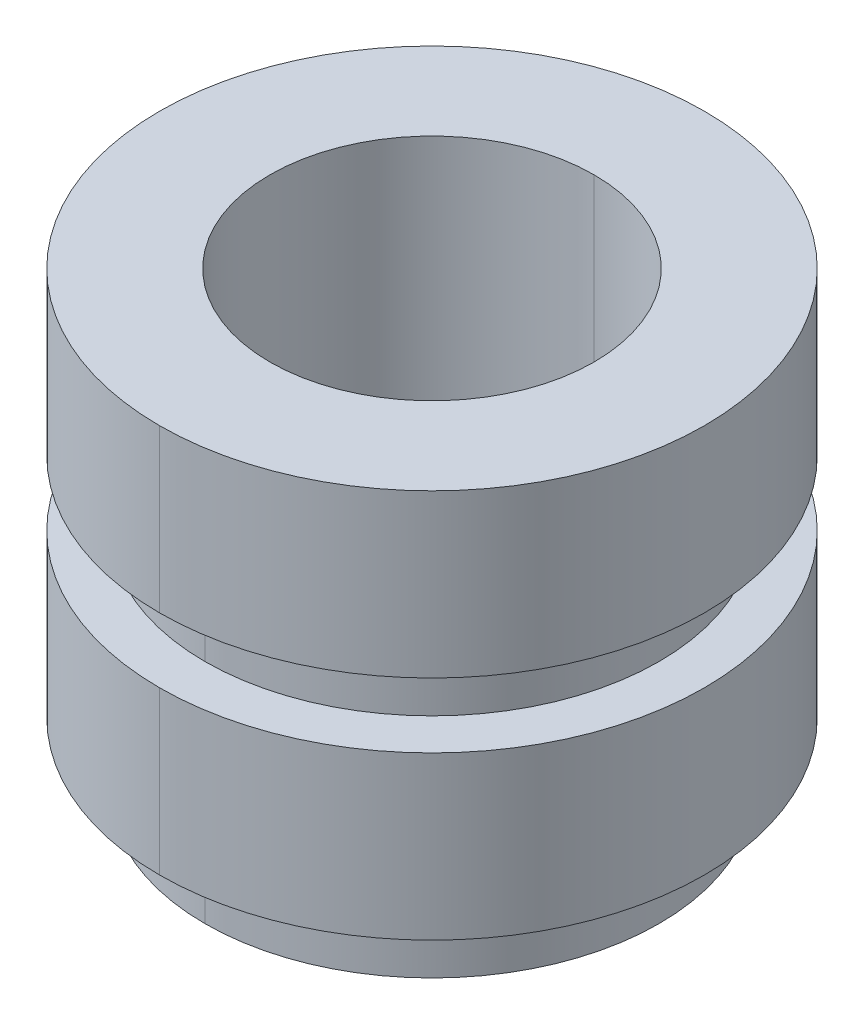
ISO-10303-21;
HEADER;
FILE_DESCRIPTION(('STEP AP214'),'2;1');
FILE_NAME('part.step','',(''),(''),'','','');
FILE_SCHEMA(('AUTOMOTIVE_DESIGN { 1 0 10303 214 1 1 1 1 }'));
ENDSEC;
DATA;
#1=APPLICATION_CONTEXT('core data for automotive mechanical design processes');
#2=APPLICATION_PROTOCOL_DEFINITION('international standard','automotive_design',2000,#1);
#3=PRODUCT_CONTEXT('',#1,'mechanical');
#4=PRODUCT('Part','Part','',(#3));
#5=PRODUCT_RELATED_PRODUCT_CATEGORY('part','',(#4));
#6=PRODUCT_DEFINITION_FORMATION('','',#4);
#7=PRODUCT_DEFINITION_CONTEXT('part definition',#1,'design');
#8=PRODUCT_DEFINITION('design','',#6,#7);
#9=PRODUCT_DEFINITION_SHAPE('','',#8);
#10=(LENGTH_UNIT() NAMED_UNIT(*) SI_UNIT(.MILLI.,.METRE.));
#11=(NAMED_UNIT(*) PLANE_ANGLE_UNIT() SI_UNIT($,.RADIAN.));
#12=(NAMED_UNIT(*) SI_UNIT($,.STERADIAN.) SOLID_ANGLE_UNIT());
#13=UNCERTAINTY_MEASURE_WITH_UNIT(LENGTH_MEASURE(1.E-05),#10,'distance_accuracy_value','');
#14=(GEOMETRIC_REPRESENTATION_CONTEXT(3) GLOBAL_UNCERTAINTY_ASSIGNED_CONTEXT((#13)) GLOBAL_UNIT_ASSIGNED_CONTEXT((#10,
#11,#12)) REPRESENTATION_CONTEXT('',''));
#15=CARTESIAN_POINT('',(0.,0.,0.));
#16=DIRECTION('',(0.,0.,1.));
#17=DIRECTION('',(1.,0.,0.));
#18=AXIS2_PLACEMENT_3D('',#15,#16,#17);
#19=CARTESIAN_POINT('',(1.75,-1.75,0.));
#20=DIRECTION('',(0.,-1.,0.));
#21=DIRECTION('',(0.,0.,-1.));
#22=AXIS2_PLACEMENT_3D('',#19,#20,#21);
#23=PLANE('',#22);
#24=CARTESIAN_POINT('',(0.,-1.75,0.));
#25=DIRECTION('',(0.,1.,0.));
#26=DIRECTION('',(0.,0.,1.));
#27=AXIS2_PLACEMENT_3D('',#24,#25,#26);
#28=CIRCLE('',#27,1.75);
#29=CARTESIAN_POINT('',(0.,-1.75,1.75));
#30=VERTEX_POINT('',#29);
#31=CARTESIAN_POINT('',(0.,-1.75,-1.75));
#32=VERTEX_POINT('',#31);
#33=EDGE_CURVE('E161',#30,#32,#28,.T.);
#34=ORIENTED_EDGE('',*,*,#33,.F.);
#35=CARTESIAN_POINT('',(0.,-1.75,0.));
#36=DIRECTION('',(0.,1.,0.));
#37=DIRECTION('',(0.,0.,1.));
#38=AXIS2_PLACEMENT_3D('',#35,#36,#37);
#39=CIRCLE('',#38,1.75);
#40=EDGE_CURVE('E171',#32,#30,#39,.T.);
#41=ORIENTED_EDGE('',*,*,#40,.F.);
#42=EDGE_LOOP('',(#34,#41));
#43=FACE_BOUND('',#42,.T.);
#44=CARTESIAN_POINT('',(0.,-1.75,0.));
#45=DIRECTION('',(0.,1.,0.));
#46=DIRECTION('',(0.,0.,1.));
#47=AXIS2_PLACEMENT_3D('',#44,#45,#46);
#48=CIRCLE('',#47,2.1);
#49=CARTESIAN_POINT('',(0.,-1.75,2.1));
#50=VERTEX_POINT('',#49);
#51=CARTESIAN_POINT('',(0.,-1.75,-2.1));
#52=VERTEX_POINT('',#51);
#53=EDGE_CURVE('E148',#50,#52,#48,.T.);
#54=ORIENTED_EDGE('',*,*,#53,.T.);
#55=CARTESIAN_POINT('',(0.,-1.75,0.));
#56=DIRECTION('',(0.,1.,0.));
#57=DIRECTION('',(0.,0.,1.));
#58=AXIS2_PLACEMENT_3D('',#55,#56,#57);
#59=CIRCLE('',#58,2.1);
#60=EDGE_CURVE('E11',#52,#50,#59,.T.);
#61=ORIENTED_EDGE('',*,*,#60,.T.);
#62=EDGE_LOOP('',(#54,#61));
#63=FACE_BOUND('',#62,.T.);
#64=ADVANCED_FACE('F16',(#43,#63),#23,.F.);
#65=CARTESIAN_POINT('',(0.,10.9807781293521,0.));
#66=DIRECTION('',(0.,1.,0.));
#67=DIRECTION('',(0.,0.,1.));
#68=AXIS2_PLACEMENT_3D('',#65,#66,#67);
#69=CYLINDRICAL_SURFACE('',#68,2.1);
#70=DIRECTION('',(0.,1.,0.));
#71=VECTOR('',#70,1.);
#72=CARTESIAN_POINT('',(0.,10.9807781293521,-2.1));
#73=LINE('',#72,#71);
#74=CARTESIAN_POINT('',(0.,-3.,-2.1));
#75=VERTEX_POINT('',#74);
#76=EDGE_CURVE('E156',#75,#52,#73,.T.);
#77=ORIENTED_EDGE('',*,*,#76,.F.);
#78=CARTESIAN_POINT('',(0.,-3.,0.));
#79=DIRECTION('',(0.,1.,0.));
#80=DIRECTION('',(0.,0.,1.));
#81=AXIS2_PLACEMENT_3D('',#78,#79,#80);
#82=CIRCLE('',#81,2.1);
#83=CARTESIAN_POINT('',(0.,-3.,2.1));
#84=VERTEX_POINT('',#83);
#85=EDGE_CURVE('E27',#75,#84,#82,.T.);
#86=ORIENTED_EDGE('',*,*,#85,.T.);
#87=DIRECTION('',(0.,1.,0.));
#88=VECTOR('',#87,1.);
#89=CARTESIAN_POINT('',(0.,10.9807781293521,2.1));
#90=LINE('',#89,#88);
#91=EDGE_CURVE('E138',#84,#50,#90,.T.);
#92=ORIENTED_EDGE('',*,*,#91,.T.);
#93=ORIENTED_EDGE('',*,*,#60,.F.);
#94=EDGE_LOOP('',(#77,#86,#92,#93));
#95=FACE_BOUND('',#94,.T.);
#96=ADVANCED_FACE('F254',(#95),#69,.T.);
#97=CARTESIAN_POINT('',(1.75,-3.,0.));
#98=DIRECTION('',(0.,1.,0.));
#99=DIRECTION('',(1.,0.,0.));
#100=AXIS2_PLACEMENT_3D('',#97,#98,#99);
#101=PLANE('',#100);
#102=CARTESIAN_POINT('',(0.,-3.,0.));
#103=DIRECTION('',(0.,1.,0.));
#104=DIRECTION('',(0.,0.,1.));
#105=AXIS2_PLACEMENT_3D('',#102,#103,#104);
#106=CIRCLE('',#105,1.75);
#107=CARTESIAN_POINT('',(0.,-3.,1.75));
#108=VERTEX_POINT('',#107);
#109=CARTESIAN_POINT('',(0.,-3.,-1.75));
#110=VERTEX_POINT('',#109);
#111=EDGE_CURVE('E132',#108,#110,#106,.T.);
#112=ORIENTED_EDGE('',*,*,#111,.T.);
#113=CARTESIAN_POINT('',(0.,-3.,0.));
#114=DIRECTION('',(0.,1.,0.));
#115=DIRECTION('',(0.,0.,1.));
#116=AXIS2_PLACEMENT_3D('',#113,#114,#115);
#117=CIRCLE('',#116,1.75);
#118=EDGE_CURVE('E127',#110,#108,#117,.T.);
#119=ORIENTED_EDGE('',*,*,#118,.T.);
#120=EDGE_LOOP('',(#112,#119));
#121=FACE_BOUND('',#120,.T.);
#122=CARTESIAN_POINT('',(0.,-3.,0.));
#123=DIRECTION('',(0.,1.,0.));
#124=DIRECTION('',(0.,0.,1.));
#125=AXIS2_PLACEMENT_3D('',#122,#123,#124);
#126=CIRCLE('',#125,2.1);
#127=EDGE_CURVE('E153',#84,#75,#126,.T.);
#128=ORIENTED_EDGE('',*,*,#127,.F.);
#129=ORIENTED_EDGE('',*,*,#85,.F.);
#130=EDGE_LOOP('',(#128,#129));
#131=FACE_BOUND('',#130,.T.);
#132=ADVANCED_FACE('F260',(#121,#131),#101,.F.);
#133=CARTESIAN_POINT('',(0.,10.9807781293521,0.));
#134=DIRECTION('',(0.,1.,0.));
#135=DIRECTION('',(0.,0.,1.));
#136=AXIS2_PLACEMENT_3D('',#133,#134,#135);
#137=CYLINDRICAL_SURFACE('',#136,1.75);
#138=DIRECTION('',(0.,1.,0.));
#139=VECTOR('',#138,1.);
#140=CARTESIAN_POINT('',(0.,10.9807781293521,-1.75));
#141=LINE('',#140,#139);
#142=CARTESIAN_POINT('',(0.,-3.5,-1.75));
#143=VERTEX_POINT('',#142);
#144=EDGE_CURVE('E122',#143,#110,#141,.T.);
#145=ORIENTED_EDGE('',*,*,#144,.F.);
#146=CARTESIAN_POINT('',(0.,-3.5,0.));
#147=DIRECTION('',(0.,1.,0.));
#148=DIRECTION('',(0.,0.,1.));
#149=AXIS2_PLACEMENT_3D('',#146,#147,#148);
#150=CIRCLE('',#149,1.75);
#151=CARTESIAN_POINT('',(0.,-3.5,1.75));
#152=VERTEX_POINT('',#151);
#153=EDGE_CURVE('E116',#143,#152,#150,.T.);
#154=ORIENTED_EDGE('',*,*,#153,.T.);
#155=DIRECTION('',(0.,1.,0.));
#156=VECTOR('',#155,1.);
#157=CARTESIAN_POINT('',(0.,10.9807781293521,1.75));
#158=LINE('',#157,#156);
#159=EDGE_CURVE('E119',#152,#108,#158,.T.);
#160=ORIENTED_EDGE('',*,*,#159,.T.);
#161=ORIENTED_EDGE('',*,*,#118,.F.);
#162=EDGE_LOOP('',(#145,#154,#160,#161));
#163=FACE_BOUND('',#162,.T.);
#164=ADVANCED_FACE('F118',(#163),#137,.T.);
#165=CARTESIAN_POINT('',(1.75,-3.5,0.));
#166=DIRECTION('',(0.,1.,0.));
#167=DIRECTION('',(1.,0.,0.));
#168=AXIS2_PLACEMENT_3D('',#165,#166,#167);
#169=PLANE('',#168);
#170=CARTESIAN_POINT('',(0.,-3.5,0.));
#171=DIRECTION('',(0.,1.,0.));
#172=DIRECTION('',(0.,0.,1.));
#173=AXIS2_PLACEMENT_3D('',#170,#171,#172);
#174=CIRCLE('',#173,1.25);
#175=CARTESIAN_POINT('',(0.,-3.5,1.25));
#176=VERTEX_POINT('',#175);
#177=CARTESIAN_POINT('',(0.,-3.5,-1.25));
#178=VERTEX_POINT('',#177);
#179=EDGE_CURVE('E20',#176,#178,#174,.T.);
#180=ORIENTED_EDGE('',*,*,#179,.T.);
#181=CARTESIAN_POINT('',(0.,-3.5,0.));
#182=DIRECTION('',(0.,1.,0.));
#183=DIRECTION('',(0.,0.,1.));
#184=AXIS2_PLACEMENT_3D('',#181,#182,#183);
#185=CIRCLE('',#184,1.25);
#186=EDGE_CURVE('E134',#178,#176,#185,.T.);
#187=ORIENTED_EDGE('',*,*,#186,.T.);
#188=EDGE_LOOP('',(#180,#187));
#189=FACE_BOUND('',#188,.T.);
#190=CARTESIAN_POINT('',(0.,-3.5,0.));
#191=DIRECTION('',(0.,1.,0.));
#192=DIRECTION('',(0.,0.,1.));
#193=AXIS2_PLACEMENT_3D('',#190,#191,#192);
#194=CIRCLE('',#193,1.75);
#195=EDGE_CURVE('E130',#152,#143,#194,.T.);
#196=ORIENTED_EDGE('',*,*,#195,.F.);
#197=ORIENTED_EDGE('',*,*,#153,.F.);
#198=EDGE_LOOP('',(#196,#197));
#199=FACE_BOUND('',#198,.T.);
#200=ADVANCED_FACE('F136',(#189,#199),#169,.F.);
#201=CARTESIAN_POINT('',(0.,10.9807781293521,0.));
#202=DIRECTION('',(0.,1.,0.));
#203=DIRECTION('',(0.,0.,1.));
#204=AXIS2_PLACEMENT_3D('',#201,#202,#203);
#205=CYLINDRICAL_SURFACE('',#204,1.25);
#206=DIRECTION('',(0.,1.,0.));
#207=VECTOR('',#206,1.);
#208=CARTESIAN_POINT('',(0.,10.9807781293521,-1.25));
#209=LINE('',#208,#207);
#210=CARTESIAN_POINT('',(0.,0.,-1.25));
#211=VERTEX_POINT('',#210);
#212=EDGE_CURVE('E179',#178,#211,#209,.T.);
#213=ORIENTED_EDGE('',*,*,#212,.F.);
#214=ORIENTED_EDGE('',*,*,#179,.F.);
#215=DIRECTION('',(0.,1.,0.));
#216=VECTOR('',#215,1.);
#217=CARTESIAN_POINT('',(0.,10.9807781293521,1.25));
#218=LINE('',#217,#216);
#219=CARTESIAN_POINT('',(0.,0.,1.25));
#220=VERTEX_POINT('',#219);
#221=EDGE_CURVE('E178',#176,#220,#218,.T.);
#222=ORIENTED_EDGE('',*,*,#221,.T.);
#223=CARTESIAN_POINT('',(0.,0.,0.));
#224=DIRECTION('',(0.,1.,0.));
#225=DIRECTION('',(0.,0.,1.));
#226=AXIS2_PLACEMENT_3D('',#223,#224,#225);
#227=CIRCLE('',#226,1.25);
#228=EDGE_CURVE('E216',#220,#211,#227,.T.);
#229=ORIENTED_EDGE('',*,*,#228,.T.);
#230=EDGE_LOOP('',(#213,#214,#222,#229));
#231=FACE_BOUND('',#230,.T.);
#232=ADVANCED_FACE('F267',(#231),#205,.F.);
#233=CARTESIAN_POINT('',(1.25,0.,0.));
#234=DIRECTION('',(0.,-1.,0.));
#235=DIRECTION('',(0.,0.,-1.));
#236=AXIS2_PLACEMENT_3D('',#233,#234,#235);
#237=PLANE('',#236);
#238=ORIENTED_EDGE('',*,*,#228,.F.);
#239=CARTESIAN_POINT('',(0.,0.,0.));
#240=DIRECTION('',(0.,1.,0.));
#241=DIRECTION('',(0.,0.,1.));
#242=AXIS2_PLACEMENT_3D('',#239,#240,#241);
#243=CIRCLE('',#242,1.25);
#244=EDGE_CURVE('E174',#211,#220,#243,.T.);
#245=ORIENTED_EDGE('',*,*,#244,.F.);
#246=EDGE_LOOP('',(#238,#245));
#247=FACE_BOUND('',#246,.T.);
#248=CARTESIAN_POINT('',(0.,0.,0.));
#249=DIRECTION('',(0.,1.,0.));
#250=DIRECTION('',(0.,0.,1.));
#251=AXIS2_PLACEMENT_3D('',#248,#249,#250);
#252=CIRCLE('',#251,2.1);
#253=CARTESIAN_POINT('',(0.,0.,2.1));
#254=VERTEX_POINT('',#253);
#255=CARTESIAN_POINT('',(0.,0.,-2.1));
#256=VERTEX_POINT('',#255);
#257=EDGE_CURVE('E162',#254,#256,#252,.T.);
#258=ORIENTED_EDGE('',*,*,#257,.T.);
#259=CARTESIAN_POINT('',(0.,0.,0.));
#260=DIRECTION('',(0.,1.,0.));
#261=DIRECTION('',(0.,0.,1.));
#262=AXIS2_PLACEMENT_3D('',#259,#260,#261);
#263=CIRCLE('',#262,2.1);
#264=EDGE_CURVE('E219',#256,#254,#263,.T.);
#265=ORIENTED_EDGE('',*,*,#264,.T.);
#266=EDGE_LOOP('',(#258,#265));
#267=FACE_BOUND('',#266,.T.);
#268=ADVANCED_FACE('F275',(#247,#267),#237,.F.);
#269=CARTESIAN_POINT('',(0.,10.9807781293521,0.));
#270=DIRECTION('',(0.,1.,0.));
#271=DIRECTION('',(0.,0.,1.));
#272=AXIS2_PLACEMENT_3D('',#269,#270,#271);
#273=CYLINDRICAL_SURFACE('',#272,2.1);
#274=DIRECTION('',(0.,1.,0.));
#275=VECTOR('',#274,1.);
#276=CARTESIAN_POINT('',(0.,10.9807781293521,-2.1));
#277=LINE('',#276,#275);
#278=CARTESIAN_POINT('',(0.,-1.25,-2.1));
#279=VERTEX_POINT('',#278);
#280=EDGE_CURVE('E180',#279,#256,#277,.T.);
#281=ORIENTED_EDGE('',*,*,#280,.F.);
#282=CARTESIAN_POINT('',(0.,-1.25,0.));
#283=DIRECTION('',(0.,1.,0.));
#284=DIRECTION('',(0.,0.,1.));
#285=AXIS2_PLACEMENT_3D('',#282,#283,#284);
#286=CIRCLE('',#285,2.1);
#287=CARTESIAN_POINT('',(0.,-1.25,2.1));
#288=VERTEX_POINT('',#287);
#289=EDGE_CURVE('E225',#279,#288,#286,.T.);
#290=ORIENTED_EDGE('',*,*,#289,.T.);
#291=DIRECTION('',(0.,1.,0.));
#292=VECTOR('',#291,1.);
#293=CARTESIAN_POINT('',(0.,10.9807781293521,2.1));
#294=LINE('',#293,#292);
#295=EDGE_CURVE('E157',#288,#254,#294,.T.);
#296=ORIENTED_EDGE('',*,*,#295,.T.);
#297=ORIENTED_EDGE('',*,*,#264,.F.);
#298=EDGE_LOOP('',(#281,#290,#296,#297));
#299=FACE_BOUND('',#298,.T.);
#300=ADVANCED_FACE('F271',(#299),#273,.T.);
#301=CARTESIAN_POINT('',(1.75,-1.25,0.));
#302=DIRECTION('',(0.,1.,0.));
#303=DIRECTION('',(1.,0.,0.));
#304=AXIS2_PLACEMENT_3D('',#301,#302,#303);
#305=PLANE('',#304);
#306=CARTESIAN_POINT('',(0.,-1.25,0.));
#307=DIRECTION('',(0.,1.,0.));
#308=DIRECTION('',(0.,0.,1.));
#309=AXIS2_PLACEMENT_3D('',#306,#307,#308);
#310=CIRCLE('',#309,1.75);
#311=CARTESIAN_POINT('',(0.,-1.25,1.75));
#312=VERTEX_POINT('',#311);
#313=CARTESIAN_POINT('',(0.,-1.25,-1.75));
#314=VERTEX_POINT('',#313);
#315=EDGE_CURVE('E167',#312,#314,#310,.T.);
#316=ORIENTED_EDGE('',*,*,#315,.T.);
#317=CARTESIAN_POINT('',(0.,-1.25,0.));
#318=DIRECTION('',(0.,1.,0.));
#319=DIRECTION('',(0.,0.,1.));
#320=AXIS2_PLACEMENT_3D('',#317,#318,#319);
#321=CIRCLE('',#320,1.75);
#322=EDGE_CURVE('E40',#314,#312,#321,.T.);
#323=ORIENTED_EDGE('',*,*,#322,.T.);
#324=EDGE_LOOP('',(#316,#323));
#325=FACE_BOUND('',#324,.T.);
#326=CARTESIAN_POINT('',(0.,-1.25,0.));
#327=DIRECTION('',(0.,1.,0.));
#328=DIRECTION('',(0.,0.,1.));
#329=AXIS2_PLACEMENT_3D('',#326,#327,#328);
#330=CIRCLE('',#329,2.1);
#331=EDGE_CURVE('E184',#288,#279,#330,.T.);
#332=ORIENTED_EDGE('',*,*,#331,.F.);
#333=ORIENTED_EDGE('',*,*,#289,.F.);
#334=EDGE_LOOP('',(#332,#333));
#335=FACE_BOUND('',#334,.T.);
#336=ADVANCED_FACE('F243',(#325,#335),#305,.F.);
#337=CARTESIAN_POINT('',(0.,10.9807781293521,0.));
#338=DIRECTION('',(0.,1.,0.));
#339=DIRECTION('',(0.,0.,1.));
#340=AXIS2_PLACEMENT_3D('',#337,#338,#339);
#341=CYLINDRICAL_SURFACE('',#340,1.75);
#342=DIRECTION('',(0.,1.,0.));
#343=VECTOR('',#342,1.);
#344=CARTESIAN_POINT('',(0.,10.9807781293521,-1.75));
#345=LINE('',#344,#343);
#346=EDGE_CURVE('E163',#32,#314,#345,.T.);
#347=ORIENTED_EDGE('',*,*,#346,.F.);
#348=ORIENTED_EDGE('',*,*,#40,.T.);
#349=DIRECTION('',(0.,1.,0.));
#350=VECTOR('',#349,1.);
#351=CARTESIAN_POINT('',(0.,10.9807781293521,1.75));
#352=LINE('',#351,#350);
#353=EDGE_CURVE('E168',#30,#312,#352,.T.);
#354=ORIENTED_EDGE('',*,*,#353,.T.);
#355=ORIENTED_EDGE('',*,*,#322,.F.);
#356=EDGE_LOOP('',(#347,#348,#354,#355));
#357=FACE_BOUND('',#356,.T.);
#358=ADVANCED_FACE('F251',(#357),#341,.T.);
#359=CARTESIAN_POINT('',(0.,10.9807781293521,0.));
#360=DIRECTION('',(0.,1.,0.));
#361=DIRECTION('',(0.,0.,1.));
#362=AXIS2_PLACEMENT_3D('',#359,#360,#361);
#363=CYLINDRICAL_SURFACE('',#362,1.75);
#364=ORIENTED_EDGE('',*,*,#33,.T.);
#365=ORIENTED_EDGE('',*,*,#346,.T.);
#366=ORIENTED_EDGE('',*,*,#315,.F.);
#367=ORIENTED_EDGE('',*,*,#353,.F.);
#368=EDGE_LOOP('',(#364,#365,#366,#367));
#369=FACE_BOUND('',#368,.T.);
#370=ADVANCED_FACE('F248',(#369),#363,.T.);
#371=CARTESIAN_POINT('',(0.,10.9807781293521,0.));
#372=DIRECTION('',(0.,1.,0.));
#373=DIRECTION('',(0.,0.,1.));
#374=AXIS2_PLACEMENT_3D('',#371,#372,#373);
#375=CYLINDRICAL_SURFACE('',#374,2.1);
#376=ORIENTED_EDGE('',*,*,#331,.T.);
#377=ORIENTED_EDGE('',*,*,#280,.T.);
#378=ORIENTED_EDGE('',*,*,#257,.F.);
#379=ORIENTED_EDGE('',*,*,#295,.F.);
#380=EDGE_LOOP('',(#376,#377,#378,#379));
#381=FACE_BOUND('',#380,.T.);
#382=ADVANCED_FACE('F288',(#381),#375,.T.);
#383=CARTESIAN_POINT('',(0.,10.9807781293521,0.));
#384=DIRECTION('',(0.,1.,0.));
#385=DIRECTION('',(0.,0.,1.));
#386=AXIS2_PLACEMENT_3D('',#383,#384,#385);
#387=CYLINDRICAL_SURFACE('',#386,1.25);
#388=ORIENTED_EDGE('',*,*,#186,.F.);
#389=ORIENTED_EDGE('',*,*,#212,.T.);
#390=ORIENTED_EDGE('',*,*,#244,.T.);
#391=ORIENTED_EDGE('',*,*,#221,.F.);
#392=EDGE_LOOP('',(#388,#389,#390,#391));
#393=FACE_BOUND('',#392,.T.);
#394=ADVANCED_FACE('F285',(#393),#387,.F.);
#395=CARTESIAN_POINT('',(0.,10.9807781293521,0.));
#396=DIRECTION('',(0.,1.,0.));
#397=DIRECTION('',(0.,0.,1.));
#398=AXIS2_PLACEMENT_3D('',#395,#396,#397);
#399=CYLINDRICAL_SURFACE('',#398,1.75);
#400=ORIENTED_EDGE('',*,*,#195,.T.);
#401=ORIENTED_EDGE('',*,*,#144,.T.);
#402=ORIENTED_EDGE('',*,*,#111,.F.);
#403=ORIENTED_EDGE('',*,*,#159,.F.);
#404=EDGE_LOOP('',(#400,#401,#402,#403));
#405=FACE_BOUND('',#404,.T.);
#406=ADVANCED_FACE('F18',(#405),#399,.T.);
#407=CARTESIAN_POINT('',(0.,10.9807781293521,0.));
#408=DIRECTION('',(0.,1.,0.));
#409=DIRECTION('',(0.,0.,1.));
#410=AXIS2_PLACEMENT_3D('',#407,#408,#409);
#411=CYLINDRICAL_SURFACE('',#410,2.1);
#412=ORIENTED_EDGE('',*,*,#127,.T.);
#413=ORIENTED_EDGE('',*,*,#76,.T.);
#414=ORIENTED_EDGE('',*,*,#53,.F.);
#415=ORIENTED_EDGE('',*,*,#91,.F.);
#416=EDGE_LOOP('',(#412,#413,#414,#415));
#417=FACE_BOUND('',#416,.T.);
#418=ADVANCED_FACE('F295',(#417),#411,.T.);
#419=CLOSED_SHELL('',(#64,#96,#132,#164,#200,#232,#268,#300,#336,#358,#370,#382,#394,#406,#418));
#420=MANIFOLD_SOLID_BREP('B1',#419);
#421=ADVANCED_BREP_SHAPE_REPRESENTATION('',(#18,#420),#14);
#422=SHAPE_DEFINITION_REPRESENTATION(#9,#421);
ENDSEC;
END-ISO-10303-21;
